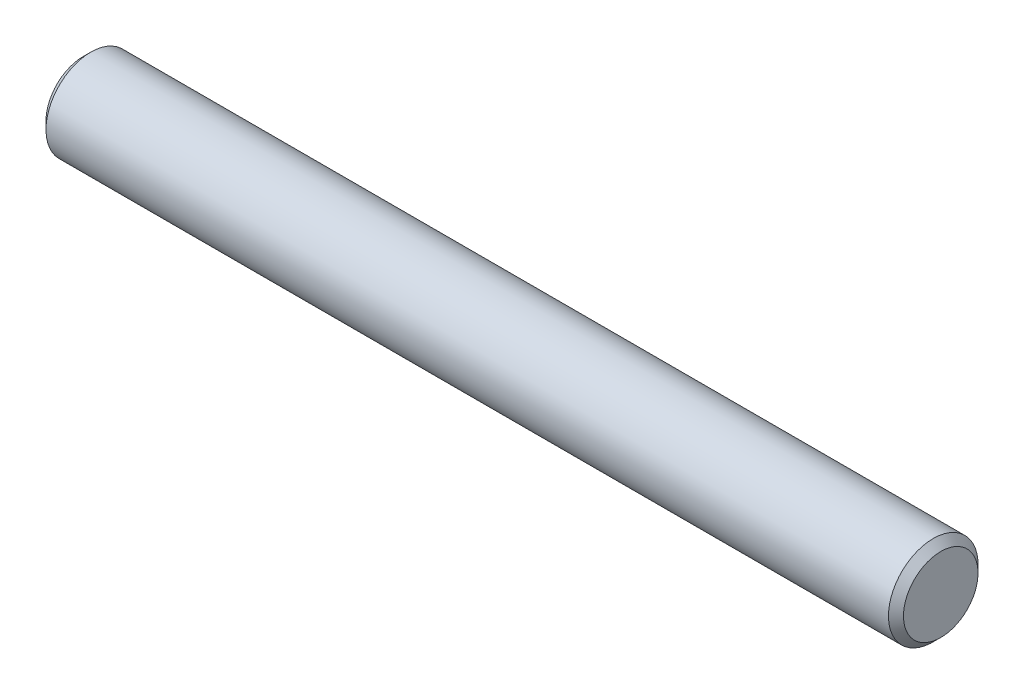
ISO-10303-21;
HEADER;
FILE_DESCRIPTION(('STEP AP214'),'2;1');
FILE_NAME('part.step','',(''),(''),'','','');
FILE_SCHEMA(('AUTOMOTIVE_DESIGN { 1 0 10303 214 1 1 1 1 }'));
ENDSEC;
DATA;
#1=APPLICATION_CONTEXT('core data for automotive mechanical design processes');
#2=APPLICATION_PROTOCOL_DEFINITION('international standard','automotive_design',2000,#1);
#3=PRODUCT_CONTEXT('',#1,'mechanical');
#4=PRODUCT('Part','Part','',(#3));
#5=PRODUCT_RELATED_PRODUCT_CATEGORY('part','',(#4));
#6=PRODUCT_DEFINITION_FORMATION('','',#4);
#7=PRODUCT_DEFINITION_CONTEXT('part definition',#1,'design');
#8=PRODUCT_DEFINITION('design','',#6,#7);
#9=PRODUCT_DEFINITION_SHAPE('','',#8);
#10=(LENGTH_UNIT() NAMED_UNIT(*) SI_UNIT(.MILLI.,.METRE.));
#11=(NAMED_UNIT(*) PLANE_ANGLE_UNIT() SI_UNIT($,.RADIAN.));
#12=(NAMED_UNIT(*) SI_UNIT($,.STERADIAN.) SOLID_ANGLE_UNIT());
#13=UNCERTAINTY_MEASURE_WITH_UNIT(LENGTH_MEASURE(1.E-05),#10,'distance_accuracy_value','');
#14=(GEOMETRIC_REPRESENTATION_CONTEXT(3) GLOBAL_UNCERTAINTY_ASSIGNED_CONTEXT((#13)) GLOBAL_UNIT_ASSIGNED_CONTEXT((#10,
#11,#12)) REPRESENTATION_CONTEXT('',''));
#15=CARTESIAN_POINT('',(0.,0.,0.));
#16=DIRECTION('',(0.,0.,1.));
#17=DIRECTION('',(1.,0.,0.));
#18=AXIS2_PLACEMENT_3D('',#15,#16,#17);
#19=CARTESIAN_POINT('',(-28.575,-6.700000062,7.2009));
#20=DIRECTION('',(1.,0.,0.));
#21=DIRECTION('',(0.,1.,0.));
#22=AXIS2_PLACEMENT_3D('',#19,#20,#21);
#23=PLANE('',#22);
#24=CARTESIAN_POINT('',(-28.575,-6.700000062,7.2009));
#25=DIRECTION('',(-1.,0.,0.));
#26=DIRECTION('',(0.,1.,0.));
#27=AXIS2_PLACEMENT_3D('',#24,#25,#26);
#28=CIRCLE('',#27,2.4845);
#29=CARTESIAN_POINT('',(-28.575,-4.215500062,7.2009));
#30=VERTEX_POINT('',#29);
#31=EDGE_CURVE('E24',#30,#30,#28,.T.);
#32=ORIENTED_EDGE('',*,*,#31,.T.);
#33=EDGE_LOOP('',(#32));
#34=FACE_BOUND('',#33,.T.);
#35=ADVANCED_FACE('F15',(#34),#23,.F.);
#36=CARTESIAN_POINT('',(28.575,-6.700000062,7.2009));
#37=DIRECTION('',(1.,0.,0.));
#38=DIRECTION('',(0.,1.,0.));
#39=AXIS2_PLACEMENT_3D('',#36,#37,#38);
#40=PLANE('',#39);
#41=CARTESIAN_POINT('',(28.575,-6.700000062,7.2009));
#42=DIRECTION('',(1.,0.,0.));
#43=DIRECTION('',(0.,1.,0.));
#44=AXIS2_PLACEMENT_3D('',#41,#42,#43);
#45=CIRCLE('',#44,2.4845);
#46=CARTESIAN_POINT('',(28.575,-4.215500062,7.2009));
#47=VERTEX_POINT('',#46);
#48=EDGE_CURVE('E34',#47,#47,#45,.T.);
#49=ORIENTED_EDGE('',*,*,#48,.T.);
#50=EDGE_LOOP('',(#49));
#51=FACE_BOUND('',#50,.T.);
#52=ADVANCED_FACE('F54',(#51),#40,.T.);
#53=CARTESIAN_POINT('',(28.575,-6.700000062,7.2009));
#54=DIRECTION('',(-1.,0.,0.));
#55=DIRECTION('',(0.,-1.,0.));
#56=AXIS2_PLACEMENT_3D('',#53,#54,#55);
#57=CYLINDRICAL_SURFACE('',#56,2.9845);
#58=CARTESIAN_POINT('',(-28.075,-6.700000062,7.2009));
#59=DIRECTION('',(1.,0.,0.));
#60=DIRECTION('',(0.,1.,0.));
#61=AXIS2_PLACEMENT_3D('',#58,#59,#60);
#62=CIRCLE('',#61,2.9845);
#63=CARTESIAN_POINT('',(-28.075,-3.715500062,7.2009));
#64=VERTEX_POINT('',#63);
#65=EDGE_CURVE('E10',#64,#64,#62,.T.);
#66=ORIENTED_EDGE('',*,*,#65,.T.);
#67=EDGE_LOOP('',(#66));
#68=FACE_BOUND('',#67,.T.);
#69=CARTESIAN_POINT('',(28.075,-6.700000062,7.2009));
#70=DIRECTION('',(-1.,0.,0.));
#71=DIRECTION('',(0.,1.,0.));
#72=AXIS2_PLACEMENT_3D('',#69,#70,#71);
#73=CIRCLE('',#72,2.9845);
#74=CARTESIAN_POINT('',(28.075,-3.715500062,7.2009));
#75=VERTEX_POINT('',#74);
#76=EDGE_CURVE('E19',#75,#75,#73,.T.);
#77=ORIENTED_EDGE('',*,*,#76,.T.);
#78=EDGE_LOOP('',(#77));
#79=FACE_BOUND('',#78,.T.);
#80=ADVANCED_FACE('F44',(#68,#79),#57,.T.);
#81=CARTESIAN_POINT('',(-28.075,-6.700000062,7.2009));
#82=DIRECTION('',(1.,0.,0.));
#83=DIRECTION('',(0.,1.,0.));
#84=AXIS2_PLACEMENT_3D('',#81,#82,#83);
#85=CONICAL_SURFACE('',#84,2.9845,0.78539816339746);
#86=ORIENTED_EDGE('',*,*,#65,.F.);
#87=EDGE_LOOP('',(#86));
#88=FACE_BOUND('',#87,.T.);
#89=ORIENTED_EDGE('',*,*,#31,.F.);
#90=EDGE_LOOP('',(#89));
#91=FACE_BOUND('',#90,.T.);
#92=ADVANCED_FACE('F48',(#88,#91),#85,.T.);
#93=CARTESIAN_POINT('',(28.575,-6.700000062,7.2009));
#94=DIRECTION('',(-1.,0.,0.));
#95=DIRECTION('',(0.,-1.,0.));
#96=AXIS2_PLACEMENT_3D('',#93,#94,#95);
#97=CONICAL_SURFACE('',#96,2.4845,0.785398163397443);
#98=ORIENTED_EDGE('',*,*,#76,.F.);
#99=EDGE_LOOP('',(#98));
#100=FACE_BOUND('',#99,.T.);
#101=ORIENTED_EDGE('',*,*,#48,.F.);
#102=EDGE_LOOP('',(#101));
#103=FACE_BOUND('',#102,.T.);
#104=ADVANCED_FACE('F17',(#100,#103),#97,.T.);
#105=CLOSED_SHELL('',(#35,#52,#80,#92,#104));
#106=MANIFOLD_SOLID_BREP('B1',#105);
#107=ADVANCED_BREP_SHAPE_REPRESENTATION('',(#18,#106),#14);
#108=SHAPE_DEFINITION_REPRESENTATION(#9,#107);
ENDSEC;
END-ISO-10303-21;
